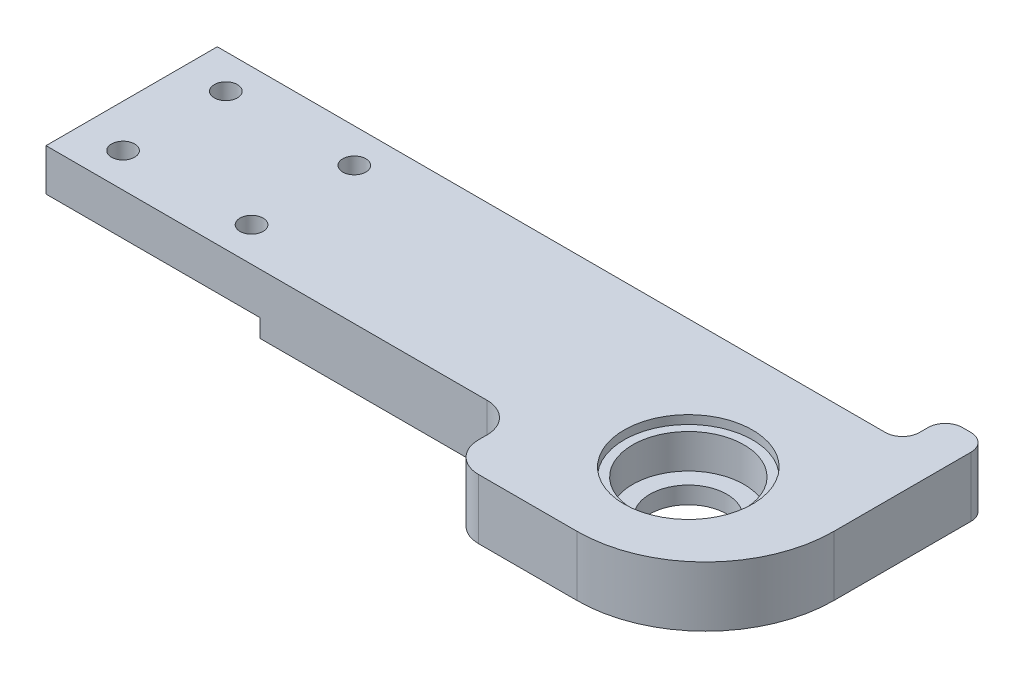
ISO-10303-21;
HEADER;
FILE_DESCRIPTION(('STEP AP214'),'2;1');
FILE_NAME('part.step','',(''),(''),'','','');
FILE_SCHEMA(('AUTOMOTIVE_DESIGN { 1 0 10303 214 1 1 1 1 }'));
ENDSEC;
DATA;
#1=APPLICATION_CONTEXT('core data for automotive mechanical design processes');
#2=APPLICATION_PROTOCOL_DEFINITION('international standard','automotive_design',2000,#1);
#3=PRODUCT_CONTEXT('',#1,'mechanical');
#4=PRODUCT('Part','Part','',(#3));
#5=PRODUCT_RELATED_PRODUCT_CATEGORY('part','',(#4));
#6=PRODUCT_DEFINITION_FORMATION('','',#4);
#7=PRODUCT_DEFINITION_CONTEXT('part definition',#1,'design');
#8=PRODUCT_DEFINITION('design','',#6,#7);
#9=PRODUCT_DEFINITION_SHAPE('','',#8);
#10=(LENGTH_UNIT() NAMED_UNIT(*) SI_UNIT(.MILLI.,.METRE.));
#11=(NAMED_UNIT(*) PLANE_ANGLE_UNIT() SI_UNIT($,.RADIAN.));
#12=(NAMED_UNIT(*) SI_UNIT($,.STERADIAN.) SOLID_ANGLE_UNIT());
#13=UNCERTAINTY_MEASURE_WITH_UNIT(LENGTH_MEASURE(1.E-05),#10,'distance_accuracy_value','');
#14=(GEOMETRIC_REPRESENTATION_CONTEXT(3) GLOBAL_UNCERTAINTY_ASSIGNED_CONTEXT((#13)) GLOBAL_UNIT_ASSIGNED_CONTEXT((#10,
#11,#12)) REPRESENTATION_CONTEXT('',''));
#15=CARTESIAN_POINT('',(0.,0.,0.));
#16=DIRECTION('',(0.,0.,1.));
#17=DIRECTION('',(1.,0.,0.));
#18=AXIS2_PLACEMENT_3D('',#15,#16,#17);
#19=CARTESIAN_POINT('',(0.,7.,-20.));
#20=DIRECTION('',(0.,0.,1.));
#21=DIRECTION('',(1.,0.,0.));
#22=AXIS2_PLACEMENT_3D('',#19,#20,#21);
#23=PLANE('',#22);
#24=DIRECTION('',(-1.,0.,0.));
#25=VECTOR('',#24,1.);
#26=CARTESIAN_POINT('',(0.,7.,-20.));
#27=LINE('',#26,#25);
#28=CARTESIAN_POINT('',(78.,7.,-20.));
#29=VERTEX_POINT('',#28);
#30=CARTESIAN_POINT('',(0.,7.,-20.));
#31=VERTEX_POINT('',#30);
#32=EDGE_CURVE('E211',#29,#31,#27,.T.);
#33=ORIENTED_EDGE('',*,*,#32,.F.);
#34=DIRECTION('',(0.,1.,0.));
#35=VECTOR('',#34,1.);
#36=CARTESIAN_POINT('',(78.,7.,-20.));
#37=LINE('',#36,#35);
#38=CARTESIAN_POINT('',(78.,0.,-20.));
#39=VERTEX_POINT('',#38);
#40=EDGE_CURVE('E312',#29,#39,#37,.F.);
#41=ORIENTED_EDGE('',*,*,#40,.T.);
#42=DIRECTION('',(-1.,0.,0.));
#43=VECTOR('',#42,1.);
#44=CARTESIAN_POINT('',(0.,0.,-20.));
#45=LINE('',#44,#43);
#46=CARTESIAN_POINT('',(25.,0.,-20.));
#47=VERTEX_POINT('',#46);
#48=EDGE_CURVE('E177',#39,#47,#45,.T.);
#49=ORIENTED_EDGE('',*,*,#48,.T.);
#50=DIRECTION('',(0.,-1.,0.));
#51=VECTOR('',#50,1.);
#52=CARTESIAN_POINT('',(25.,2.1,-20.));
#53=LINE('',#52,#51);
#54=CARTESIAN_POINT('',(25.,2.1,-20.));
#55=VERTEX_POINT('',#54);
#56=EDGE_CURVE('E157',#55,#47,#53,.T.);
#57=ORIENTED_EDGE('',*,*,#56,.F.);
#58=DIRECTION('',(1.,0.,0.));
#59=VECTOR('',#58,1.);
#60=CARTESIAN_POINT('',(0.,2.1,-20.));
#61=LINE('',#60,#59);
#62=CARTESIAN_POINT('',(0.,2.1,-20.));
#63=VERTEX_POINT('',#62);
#64=EDGE_CURVE('E165',#63,#55,#61,.T.);
#65=ORIENTED_EDGE('',*,*,#64,.F.);
#66=DIRECTION('',(0.,-1.,0.));
#67=VECTOR('',#66,1.);
#68=CARTESIAN_POINT('',(0.,7.,-20.));
#69=LINE('',#68,#67);
#70=EDGE_CURVE('E214',#31,#63,#69,.T.);
#71=ORIENTED_EDGE('',*,*,#70,.F.);
#72=EDGE_LOOP('',(#33,#41,#49,#57,#65,#71));
#73=FACE_BOUND('',#72,.T.);
#74=ADVANCED_FACE('F39',(#73),#23,.F.);
#75=CARTESIAN_POINT('',(70.,7.,-5.));
#76=DIRECTION('',(0.,-1.,0.));
#77=DIRECTION('',(0.,0.,-1.));
#78=AXIS2_PLACEMENT_3D('',#75,#76,#77);
#79=CYLINDRICAL_SURFACE('',#78,4.5);
#80=CARTESIAN_POINT('',(70.,0.,-5.));
#81=DIRECTION('',(0.,1.,0.));
#82=DIRECTION('',(0.,0.,1.));
#83=AXIS2_PLACEMENT_3D('',#80,#81,#82);
#84=CIRCLE('',#83,4.5);
#85=CARTESIAN_POINT('',(70.,0.,-0.499999999999995));
#86=VERTEX_POINT('',#85);
#87=EDGE_CURVE('E182',#86,#86,#84,.T.);
#88=ORIENTED_EDGE('',*,*,#87,.F.);
#89=EDGE_LOOP('',(#88));
#90=FACE_BOUND('',#89,.T.);
#91=CARTESIAN_POINT('',(70.,2.,-5.));
#92=DIRECTION('',(0.,1.,0.));
#93=DIRECTION('',(0.,0.,1.));
#94=AXIS2_PLACEMENT_3D('',#91,#92,#93);
#95=CIRCLE('',#94,4.5);
#96=CARTESIAN_POINT('',(70.,2.,-0.499999999999995));
#97=VERTEX_POINT('',#96);
#98=EDGE_CURVE('E265',#97,#97,#95,.T.);
#99=ORIENTED_EDGE('',*,*,#98,.T.);
#100=EDGE_LOOP('',(#99));
#101=FACE_BOUND('',#100,.T.);
#102=ADVANCED_FACE('F437',(#90,#101),#79,.F.);
#103=CARTESIAN_POINT('',(0.,7.,0.));
#104=DIRECTION('',(1.,0.,0.));
#105=DIRECTION('',(0.,0.,-1.));
#106=AXIS2_PLACEMENT_3D('',#103,#104,#105);
#107=PLANE('',#106);
#108=DIRECTION('',(0.,0.,-1.));
#109=VECTOR('',#108,1.);
#110=CARTESIAN_POINT('',(0.,2.1,0.));
#111=LINE('',#110,#109);
#112=CARTESIAN_POINT('',(0.,2.1,0.));
#113=VERTEX_POINT('',#112);
#114=EDGE_CURVE('E170',#113,#63,#111,.T.);
#115=ORIENTED_EDGE('',*,*,#114,.F.);
#116=DIRECTION('',(0.,-1.,0.));
#117=VECTOR('',#116,1.);
#118=CARTESIAN_POINT('',(0.,7.,0.));
#119=LINE('',#118,#117);
#120=CARTESIAN_POINT('',(0.,7.,0.));
#121=VERTEX_POINT('',#120);
#122=EDGE_CURVE('E234',#121,#113,#119,.T.);
#123=ORIENTED_EDGE('',*,*,#122,.F.);
#124=DIRECTION('',(0.,0.,1.));
#125=VECTOR('',#124,1.);
#126=CARTESIAN_POINT('',(0.,7.,0.));
#127=LINE('',#126,#125);
#128=EDGE_CURVE('E191',#31,#121,#127,.T.);
#129=ORIENTED_EDGE('',*,*,#128,.F.);
#130=ORIENTED_EDGE('',*,*,#70,.T.);
#131=EDGE_LOOP('',(#115,#123,#129,#130));
#132=FACE_BOUND('',#131,.T.);
#133=ADVANCED_FACE('F442',(#132),#107,.F.);
#134=CARTESIAN_POINT('',(0.,7.,0.));
#135=DIRECTION('',(0.,-1.,0.));
#136=DIRECTION('',(0.,0.,-1.));
#137=AXIS2_PLACEMENT_3D('',#134,#135,#136);
#138=PLANE('',#137);
#139=CARTESIAN_POINT('',(70.,7.,-5.));
#140=DIRECTION('',(0.,1.,0.));
#141=DIRECTION('',(0.,0.,1.));
#142=AXIS2_PLACEMENT_3D('',#139,#140,#141);
#143=CIRCLE('',#142,7.5);
#144=CARTESIAN_POINT('',(70.,7.,2.5));
#145=VERTEX_POINT('',#144);
#146=EDGE_CURVE('E269',#145,#145,#143,.T.);
#147=ORIENTED_EDGE('',*,*,#146,.F.);
#148=EDGE_LOOP('',(#147));
#149=FACE_BOUND('',#148,.T.);
#150=CARTESIAN_POINT('',(5.,7.,-16.));
#151=DIRECTION('',(0.,-1.,0.));
#152=DIRECTION('',(0.,0.,-1.));
#153=AXIS2_PLACEMENT_3D('',#150,#151,#152);
#154=CIRCLE('',#153,1.35);
#155=CARTESIAN_POINT('',(5.,7.,-17.35));
#156=VERTEX_POINT('',#155);
#157=EDGE_CURVE('E376',#156,#156,#154,.T.);
#158=ORIENTED_EDGE('',*,*,#157,.T.);
#159=EDGE_LOOP('',(#158));
#160=FACE_BOUND('',#159,.T.);
#161=CARTESIAN_POINT('',(20.,7.,-16.));
#162=DIRECTION('',(0.,-1.,0.));
#163=DIRECTION('',(0.,0.,-1.));
#164=AXIS2_PLACEMENT_3D('',#161,#162,#163);
#165=CIRCLE('',#164,1.35);
#166=CARTESIAN_POINT('',(20.,7.,-17.35));
#167=VERTEX_POINT('',#166);
#168=EDGE_CURVE('E372',#167,#167,#165,.T.);
#169=ORIENTED_EDGE('',*,*,#168,.T.);
#170=EDGE_LOOP('',(#169));
#171=FACE_BOUND('',#170,.T.);
#172=CARTESIAN_POINT('',(20.,7.,-4.));
#173=DIRECTION('',(0.,-1.,0.));
#174=DIRECTION('',(0.,0.,-1.));
#175=AXIS2_PLACEMENT_3D('',#172,#173,#174);
#176=CIRCLE('',#175,1.35);
#177=CARTESIAN_POINT('',(20.,7.,-5.35));
#178=VERTEX_POINT('',#177);
#179=EDGE_CURVE('E368',#178,#178,#176,.T.);
#180=ORIENTED_EDGE('',*,*,#179,.T.);
#181=EDGE_LOOP('',(#180));
#182=FACE_BOUND('',#181,.T.);
#183=CARTESIAN_POINT('',(5.,7.,-4.));
#184=DIRECTION('',(0.,-1.,0.));
#185=DIRECTION('',(0.,0.,-1.));
#186=AXIS2_PLACEMENT_3D('',#183,#184,#185);
#187=CIRCLE('',#186,1.35);
#188=CARTESIAN_POINT('',(5.,7.,-5.35));
#189=VERTEX_POINT('',#188);
#190=EDGE_CURVE('E364',#189,#189,#187,.T.);
#191=ORIENTED_EDGE('',*,*,#190,.T.);
#192=EDGE_LOOP('',(#191));
#193=FACE_BOUND('',#192,.T.);
#194=DIRECTION('',(0.,0.,-1.));
#195=VECTOR('',#194,1.);
#196=CARTESIAN_POINT('',(85.,7.,0.));
#197=LINE('',#196,#195);
#198=CARTESIAN_POINT('',(85.,7.,-7.));
#199=VERTEX_POINT('',#198);
#200=CARTESIAN_POINT('',(85.,7.,-23.));
#201=VERTEX_POINT('',#200);
#202=EDGE_CURVE('E207',#199,#201,#197,.T.);
#203=ORIENTED_EDGE('',*,*,#202,.T.);
#204=CARTESIAN_POINT('',(83.,7.,-23.));
#205=DIRECTION('',(0.,-1.,0.));
#206=DIRECTION('',(0.,0.,-1.));
#207=AXIS2_PLACEMENT_3D('',#204,#205,#206);
#208=CIRCLE('',#207,2.);
#209=CARTESIAN_POINT('',(83.,7.,-25.));
#210=VERTEX_POINT('',#209);
#211=EDGE_CURVE('E290',#201,#210,#208,.F.);
#212=ORIENTED_EDGE('',*,*,#211,.T.);
#213=DIRECTION('',(-1.,0.,0.));
#214=VECTOR('',#213,1.);
#215=CARTESIAN_POINT('',(85.,7.,-25.));
#216=LINE('',#215,#214);
#217=CARTESIAN_POINT('',(82.,7.,-25.));
#218=VERTEX_POINT('',#217);
#219=EDGE_CURVE('E419',#210,#218,#216,.T.);
#220=ORIENTED_EDGE('',*,*,#219,.T.);
#221=CARTESIAN_POINT('',(82.,7.,-23.));
#222=DIRECTION('',(0.,-1.,0.));
#223=DIRECTION('',(0.,0.,-1.));
#224=AXIS2_PLACEMENT_3D('',#221,#222,#223);
#225=CIRCLE('',#224,2.);
#226=CARTESIAN_POINT('',(80.,7.,-23.));
#227=VERTEX_POINT('',#226);
#228=EDGE_CURVE('E287',#218,#227,#225,.F.);
#229=ORIENTED_EDGE('',*,*,#228,.T.);
#230=DIRECTION('',(0.,0.,1.));
#231=VECTOR('',#230,1.);
#232=CARTESIAN_POINT('',(80.,7.,-20.));
#233=LINE('',#232,#231);
#234=CARTESIAN_POINT('',(80.,7.,-22.));
#235=VERTEX_POINT('',#234);
#236=EDGE_CURVE('E318',#227,#235,#233,.T.);
#237=ORIENTED_EDGE('',*,*,#236,.T.);
#238=CARTESIAN_POINT('',(78.,7.,-22.));
#239=DIRECTION('',(0.,-1.,0.));
#240=DIRECTION('',(0.,0.,-1.));
#241=AXIS2_PLACEMENT_3D('',#238,#239,#240);
#242=CIRCLE('',#241,2.);
#243=EDGE_CURVE('E48',#235,#29,#242,.T.);
#244=ORIENTED_EDGE('',*,*,#243,.T.);
#245=ORIENTED_EDGE('',*,*,#32,.T.);
#246=ORIENTED_EDGE('',*,*,#128,.T.);
#247=DIRECTION('',(1.,0.,0.));
#248=VECTOR('',#247,1.);
#249=CARTESIAN_POINT('',(0.,7.,0.));
#250=LINE('',#249,#248);
#251=CARTESIAN_POINT('',(51.5,7.,0.));
#252=VERTEX_POINT('',#251);
#253=EDGE_CURVE('E195',#121,#252,#250,.T.);
#254=ORIENTED_EDGE('',*,*,#253,.T.);
#255=CARTESIAN_POINT('',(51.5,7.,3.5));
#256=DIRECTION('',(0.,-1.,0.));
#257=DIRECTION('',(0.,0.,-1.));
#258=AXIS2_PLACEMENT_3D('',#255,#256,#257);
#259=CIRCLE('',#258,3.5);
#260=CARTESIAN_POINT('',(55.,7.,3.5));
#261=VERTEX_POINT('',#260);
#262=EDGE_CURVE('E261',#252,#261,#259,.T.);
#263=ORIENTED_EDGE('',*,*,#262,.T.);
#264=DIRECTION('',(0.,0.,1.));
#265=VECTOR('',#264,1.);
#266=CARTESIAN_POINT('',(55.,7.,0.));
#267=LINE('',#266,#265);
#268=CARTESIAN_POINT('',(55.,7.,4.5));
#269=VERTEX_POINT('',#268);
#270=EDGE_CURVE('E199',#261,#269,#267,.T.);
#271=ORIENTED_EDGE('',*,*,#270,.T.);
#272=CARTESIAN_POINT('',(58.5,7.,4.5));
#273=DIRECTION('',(0.,-1.,0.));
#274=DIRECTION('',(0.,0.,-1.));
#275=AXIS2_PLACEMENT_3D('',#272,#273,#274);
#276=CIRCLE('',#275,3.5);
#277=CARTESIAN_POINT('',(58.5,7.,8.));
#278=VERTEX_POINT('',#277);
#279=EDGE_CURVE('E252',#269,#278,#276,.F.);
#280=ORIENTED_EDGE('',*,*,#279,.T.);
#281=DIRECTION('',(1.,0.,0.));
#282=VECTOR('',#281,1.);
#283=CARTESIAN_POINT('',(85.,7.,8.));
#284=LINE('',#283,#282);
#285=CARTESIAN_POINT('',(70.,7.,8.));
#286=VERTEX_POINT('',#285);
#287=EDGE_CURVE('E203',#278,#286,#284,.T.);
#288=ORIENTED_EDGE('',*,*,#287,.T.);
#289=CARTESIAN_POINT('',(70.,7.,-7.));
#290=DIRECTION('',(0.,-1.,0.));
#291=DIRECTION('',(0.,0.,-1.));
#292=AXIS2_PLACEMENT_3D('',#289,#290,#291);
#293=CIRCLE('',#292,15.);
#294=EDGE_CURVE('E280',#286,#199,#293,.F.);
#295=ORIENTED_EDGE('',*,*,#294,.T.);
#296=EDGE_LOOP('',(#203,#212,#220,#229,#237,#244,#245,#246,#254,#263,#271,#280,#288,#295));
#297=FACE_BOUND('',#296,.T.);
#298=ADVANCED_FACE('F317',(#149,#160,#171,#182,#193,#297),#138,.F.);
#299=CARTESIAN_POINT('',(0.,0.,0.));
#300=DIRECTION('',(0.,-1.,0.));
#301=DIRECTION('',(0.,0.,-1.));
#302=AXIS2_PLACEMENT_3D('',#299,#300,#301);
#303=PLANE('',#302);
#304=DIRECTION('',(-1.,0.,0.));
#305=VECTOR('',#304,1.);
#306=CARTESIAN_POINT('',(85.,0.,-25.));
#307=LINE('',#306,#305);
#308=CARTESIAN_POINT('',(83.,0.,-25.));
#309=VERTEX_POINT('',#308);
#310=CARTESIAN_POINT('',(82.,0.,-25.));
#311=VERTEX_POINT('',#310);
#312=EDGE_CURVE('E328',#309,#311,#307,.T.);
#313=ORIENTED_EDGE('',*,*,#312,.F.);
#314=CARTESIAN_POINT('',(83.,0.,-23.));
#315=DIRECTION('',(0.,-1.,0.));
#316=DIRECTION('',(0.,0.,-1.));
#317=AXIS2_PLACEMENT_3D('',#314,#315,#316);
#318=CIRCLE('',#317,2.);
#319=CARTESIAN_POINT('',(85.,0.,-23.));
#320=VERTEX_POINT('',#319);
#321=EDGE_CURVE('E303',#309,#320,#318,.T.);
#322=ORIENTED_EDGE('',*,*,#321,.T.);
#323=DIRECTION('',(0.,0.,-1.));
#324=VECTOR('',#323,1.);
#325=CARTESIAN_POINT('',(85.,0.,0.));
#326=LINE('',#325,#324);
#327=CARTESIAN_POINT('',(85.,0.,-7.));
#328=VERTEX_POINT('',#327);
#329=EDGE_CURVE('E226',#328,#320,#326,.T.);
#330=ORIENTED_EDGE('',*,*,#329,.F.);
#331=CARTESIAN_POINT('',(70.,0.,-7.));
#332=DIRECTION('',(0.,-1.,0.));
#333=DIRECTION('',(0.,0.,-1.));
#334=AXIS2_PLACEMENT_3D('',#331,#332,#333);
#335=CIRCLE('',#334,15.);
#336=CARTESIAN_POINT('',(70.,0.,8.));
#337=VERTEX_POINT('',#336);
#338=EDGE_CURVE('E274',#328,#337,#335,.T.);
#339=ORIENTED_EDGE('',*,*,#338,.T.);
#340=DIRECTION('',(1.,0.,0.));
#341=VECTOR('',#340,1.);
#342=CARTESIAN_POINT('',(85.,0.,8.));
#343=LINE('',#342,#341);
#344=CARTESIAN_POINT('',(58.5,0.,8.));
#345=VERTEX_POINT('',#344);
#346=EDGE_CURVE('E222',#345,#337,#343,.T.);
#347=ORIENTED_EDGE('',*,*,#346,.F.);
#348=CARTESIAN_POINT('',(58.5,0.,4.5));
#349=DIRECTION('',(0.,-1.,0.));
#350=DIRECTION('',(0.,0.,-1.));
#351=AXIS2_PLACEMENT_3D('',#348,#349,#350);
#352=CIRCLE('',#351,3.5);
#353=CARTESIAN_POINT('',(55.,0.,4.5));
#354=VERTEX_POINT('',#353);
#355=EDGE_CURVE('E242',#345,#354,#352,.T.);
#356=ORIENTED_EDGE('',*,*,#355,.T.);
#357=DIRECTION('',(0.,0.,1.));
#358=VECTOR('',#357,1.);
#359=CARTESIAN_POINT('',(55.,0.,0.));
#360=LINE('',#359,#358);
#361=CARTESIAN_POINT('',(55.,0.,3.5));
#362=VERTEX_POINT('',#361);
#363=EDGE_CURVE('E218',#362,#354,#360,.T.);
#364=ORIENTED_EDGE('',*,*,#363,.F.);
#365=CARTESIAN_POINT('',(51.5,0.,3.5));
#366=DIRECTION('',(0.,-1.,0.));
#367=DIRECTION('',(0.,0.,-1.));
#368=AXIS2_PLACEMENT_3D('',#365,#366,#367);
#369=CIRCLE('',#368,3.5);
#370=CARTESIAN_POINT('',(51.5,0.,0.));
#371=VERTEX_POINT('',#370);
#372=EDGE_CURVE('E258',#362,#371,#369,.F.);
#373=ORIENTED_EDGE('',*,*,#372,.T.);
#374=DIRECTION('',(1.,0.,0.));
#375=VECTOR('',#374,1.);
#376=CARTESIAN_POINT('',(0.,0.,0.));
#377=LINE('',#376,#375);
#378=CARTESIAN_POINT('',(25.,0.,0.));
#379=VERTEX_POINT('',#378);
#380=EDGE_CURVE('E190',#379,#371,#377,.T.);
#381=ORIENTED_EDGE('',*,*,#380,.F.);
#382=DIRECTION('',(0.,0.,1.));
#383=VECTOR('',#382,1.);
#384=CARTESIAN_POINT('',(25.,0.,0.));
#385=LINE('',#384,#383);
#386=EDGE_CURVE('E380',#47,#379,#385,.T.);
#387=ORIENTED_EDGE('',*,*,#386,.F.);
#388=ORIENTED_EDGE('',*,*,#48,.F.);
#389=CARTESIAN_POINT('',(78.,0.,-22.));
#390=DIRECTION('',(0.,-1.,0.));
#391=DIRECTION('',(0.,0.,-1.));
#392=AXIS2_PLACEMENT_3D('',#389,#390,#391);
#393=CIRCLE('',#392,2.);
#394=CARTESIAN_POINT('',(80.,0.,-22.));
#395=VERTEX_POINT('',#394);
#396=EDGE_CURVE('E11',#39,#395,#393,.F.);
#397=ORIENTED_EDGE('',*,*,#396,.T.);
#398=DIRECTION('',(0.,0.,1.));
#399=VECTOR('',#398,1.);
#400=CARTESIAN_POINT('',(80.,0.,-20.));
#401=LINE('',#400,#399);
#402=CARTESIAN_POINT('',(80.,0.,-23.));
#403=VERTEX_POINT('',#402);
#404=EDGE_CURVE('E324',#403,#395,#401,.T.);
#405=ORIENTED_EDGE('',*,*,#404,.F.);
#406=CARTESIAN_POINT('',(82.,0.,-23.));
#407=DIRECTION('',(0.,-1.,0.));
#408=DIRECTION('',(0.,0.,-1.));
#409=AXIS2_PLACEMENT_3D('',#406,#407,#408);
#410=CIRCLE('',#409,2.);
#411=EDGE_CURVE('E300',#403,#311,#410,.T.);
#412=ORIENTED_EDGE('',*,*,#411,.T.);
#413=EDGE_LOOP('',(#313,#322,#330,#339,#347,#356,#364,#373,#381,#387,#388,#397,#405,#412));
#414=FACE_BOUND('',#413,.T.);
#415=ORIENTED_EDGE('',*,*,#87,.T.);
#416=EDGE_LOOP('',(#415));
#417=FACE_BOUND('',#416,.T.);
#418=ADVANCED_FACE('F388',(#414,#417),#303,.T.);
#419=CARTESIAN_POINT('',(0.,7.,0.));
#420=DIRECTION('',(0.,0.,-1.));
#421=DIRECTION('',(-1.,0.,0.));
#422=AXIS2_PLACEMENT_3D('',#419,#420,#421);
#423=PLANE('',#422);
#424=ORIENTED_EDGE('',*,*,#380,.T.);
#425=DIRECTION('',(0.,-1.,0.));
#426=VECTOR('',#425,1.);
#427=CARTESIAN_POINT('',(51.5,7.,0.));
#428=LINE('',#427,#426);
#429=EDGE_CURVE('E255',#371,#252,#428,.F.);
#430=ORIENTED_EDGE('',*,*,#429,.T.);
#431=ORIENTED_EDGE('',*,*,#253,.F.);
#432=ORIENTED_EDGE('',*,*,#122,.T.);
#433=DIRECTION('',(-1.,0.,0.));
#434=VECTOR('',#433,1.);
#435=CARTESIAN_POINT('',(0.,2.1,0.));
#436=LINE('',#435,#434);
#437=CARTESIAN_POINT('',(25.,2.1,0.));
#438=VERTEX_POINT('',#437);
#439=EDGE_CURVE('E164',#438,#113,#436,.T.);
#440=ORIENTED_EDGE('',*,*,#439,.F.);
#441=DIRECTION('',(0.,-1.,0.));
#442=VECTOR('',#441,1.);
#443=CARTESIAN_POINT('',(25.,2.1,0.));
#444=LINE('',#443,#442);
#445=EDGE_CURVE('E160',#438,#379,#444,.T.);
#446=ORIENTED_EDGE('',*,*,#445,.T.);
#447=EDGE_LOOP('',(#424,#430,#431,#432,#440,#446));
#448=FACE_BOUND('',#447,.T.);
#449=ADVANCED_FACE('F385',(#448),#423,.F.);
#450=CARTESIAN_POINT('',(55.,7.,0.));
#451=DIRECTION('',(1.,0.,0.));
#452=DIRECTION('',(0.,0.,-1.));
#453=AXIS2_PLACEMENT_3D('',#450,#451,#452);
#454=PLANE('',#453);
#455=ORIENTED_EDGE('',*,*,#363,.T.);
#456=DIRECTION('',(0.,-1.,0.));
#457=VECTOR('',#456,1.);
#458=CARTESIAN_POINT('',(55.,7.,4.5));
#459=LINE('',#458,#457);
#460=EDGE_CURVE('E249',#354,#269,#459,.F.);
#461=ORIENTED_EDGE('',*,*,#460,.T.);
#462=ORIENTED_EDGE('',*,*,#270,.F.);
#463=DIRECTION('',(0.,-1.,0.));
#464=VECTOR('',#463,1.);
#465=CARTESIAN_POINT('',(55.,0.,3.5));
#466=LINE('',#465,#464);
#467=EDGE_CURVE('E245',#261,#362,#466,.T.);
#468=ORIENTED_EDGE('',*,*,#467,.T.);
#469=EDGE_LOOP('',(#455,#461,#462,#468));
#470=FACE_BOUND('',#469,.T.);
#471=ADVANCED_FACE('F397',(#470),#454,.F.);
#472=CARTESIAN_POINT('',(85.,7.,8.));
#473=DIRECTION('',(0.,0.,-1.));
#474=DIRECTION('',(-1.,0.,0.));
#475=AXIS2_PLACEMENT_3D('',#472,#473,#474);
#476=PLANE('',#475);
#477=ORIENTED_EDGE('',*,*,#346,.T.);
#478=DIRECTION('',(0.,-1.,0.));
#479=VECTOR('',#478,1.);
#480=CARTESIAN_POINT('',(70.,7.,8.));
#481=LINE('',#480,#479);
#482=EDGE_CURVE('E277',#337,#286,#481,.F.);
#483=ORIENTED_EDGE('',*,*,#482,.T.);
#484=ORIENTED_EDGE('',*,*,#287,.F.);
#485=DIRECTION('',(0.,-1.,0.));
#486=VECTOR('',#485,1.);
#487=CARTESIAN_POINT('',(58.5,7.,8.));
#488=LINE('',#487,#486);
#489=EDGE_CURVE('E238',#278,#345,#488,.T.);
#490=ORIENTED_EDGE('',*,*,#489,.T.);
#491=EDGE_LOOP('',(#477,#483,#484,#490));
#492=FACE_BOUND('',#491,.T.);
#493=ADVANCED_FACE('F406',(#492),#476,.F.);
#494=CARTESIAN_POINT('',(85.,7.,0.));
#495=DIRECTION('',(-1.,0.,0.));
#496=DIRECTION('',(0.,0.,1.));
#497=AXIS2_PLACEMENT_3D('',#494,#495,#496);
#498=PLANE('',#497);
#499=ORIENTED_EDGE('',*,*,#329,.T.);
#500=DIRECTION('',(0.,1.,0.));
#501=VECTOR('',#500,1.);
#502=CARTESIAN_POINT('',(85.,7.,-23.));
#503=LINE('',#502,#501);
#504=EDGE_CURVE('E283',#320,#201,#503,.T.);
#505=ORIENTED_EDGE('',*,*,#504,.T.);
#506=ORIENTED_EDGE('',*,*,#202,.F.);
#507=DIRECTION('',(0.,-1.,0.));
#508=VECTOR('',#507,1.);
#509=CARTESIAN_POINT('',(85.,7.,-7.));
#510=LINE('',#509,#508);
#511=EDGE_CURVE('E264',#199,#328,#510,.T.);
#512=ORIENTED_EDGE('',*,*,#511,.T.);
#513=EDGE_LOOP('',(#499,#505,#506,#512));
#514=FACE_BOUND('',#513,.T.);
#515=ADVANCED_FACE('F415',(#514),#498,.F.);
#516=CARTESIAN_POINT('',(25.,2.1,0.));
#517=DIRECTION('',(1.,0.,0.));
#518=DIRECTION('',(0.,0.,-1.));
#519=AXIS2_PLACEMENT_3D('',#516,#517,#518);
#520=PLANE('',#519);
#521=ORIENTED_EDGE('',*,*,#386,.T.);
#522=ORIENTED_EDGE('',*,*,#445,.F.);
#523=DIRECTION('',(0.,0.,1.));
#524=VECTOR('',#523,1.);
#525=CARTESIAN_POINT('',(25.,2.1,0.));
#526=LINE('',#525,#524);
#527=EDGE_CURVE('E153',#55,#438,#526,.T.);
#528=ORIENTED_EDGE('',*,*,#527,.F.);
#529=ORIENTED_EDGE('',*,*,#56,.T.);
#530=EDGE_LOOP('',(#521,#522,#528,#529));
#531=FACE_BOUND('',#530,.T.);
#532=ADVANCED_FACE('F155',(#531),#520,.F.);
#533=CARTESIAN_POINT('',(0.,2.1,0.));
#534=DIRECTION('',(0.,-1.,0.));
#535=DIRECTION('',(0.,0.,-1.));
#536=AXIS2_PLACEMENT_3D('',#533,#534,#535);
#537=PLANE('',#536);
#538=CARTESIAN_POINT('',(5.,2.1,-16.));
#539=DIRECTION('',(0.,-1.,0.));
#540=DIRECTION('',(0.,0.,-1.));
#541=AXIS2_PLACEMENT_3D('',#538,#539,#540);
#542=CIRCLE('',#541,1.35);
#543=CARTESIAN_POINT('',(5.,2.1,-17.35));
#544=VERTEX_POINT('',#543);
#545=EDGE_CURVE('E345',#544,#544,#542,.T.);
#546=ORIENTED_EDGE('',*,*,#545,.F.);
#547=EDGE_LOOP('',(#546));
#548=FACE_BOUND('',#547,.T.);
#549=CARTESIAN_POINT('',(20.,2.1,-16.));
#550=DIRECTION('',(0.,-1.,0.));
#551=DIRECTION('',(0.,0.,-1.));
#552=AXIS2_PLACEMENT_3D('',#549,#550,#551);
#553=CIRCLE('',#552,1.35);
#554=CARTESIAN_POINT('',(20.,2.1,-17.35));
#555=VERTEX_POINT('',#554);
#556=EDGE_CURVE('E354',#555,#555,#553,.T.);
#557=ORIENTED_EDGE('',*,*,#556,.F.);
#558=EDGE_LOOP('',(#557));
#559=FACE_BOUND('',#558,.T.);
#560=CARTESIAN_POINT('',(20.,2.1,-4.));
#561=DIRECTION('',(0.,-1.,0.));
#562=DIRECTION('',(0.,0.,-1.));
#563=AXIS2_PLACEMENT_3D('',#560,#561,#562);
#564=CIRCLE('',#563,1.35);
#565=CARTESIAN_POINT('',(20.,2.1,-5.35));
#566=VERTEX_POINT('',#565);
#567=EDGE_CURVE('E349',#566,#566,#564,.T.);
#568=ORIENTED_EDGE('',*,*,#567,.F.);
#569=EDGE_LOOP('',(#568));
#570=FACE_BOUND('',#569,.T.);
#571=CARTESIAN_POINT('',(5.,2.1,-4.));
#572=DIRECTION('',(0.,-1.,0.));
#573=DIRECTION('',(0.,0.,-1.));
#574=AXIS2_PLACEMENT_3D('',#571,#572,#573);
#575=CIRCLE('',#574,1.35);
#576=CARTESIAN_POINT('',(5.,2.1,-5.35));
#577=VERTEX_POINT('',#576);
#578=EDGE_CURVE('E353',#577,#577,#575,.T.);
#579=ORIENTED_EDGE('',*,*,#578,.F.);
#580=EDGE_LOOP('',(#579));
#581=FACE_BOUND('',#580,.T.);
#582=ORIENTED_EDGE('',*,*,#114,.T.);
#583=ORIENTED_EDGE('',*,*,#64,.T.);
#584=ORIENTED_EDGE('',*,*,#527,.T.);
#585=ORIENTED_EDGE('',*,*,#439,.T.);
#586=EDGE_LOOP('',(#582,#583,#584,#585));
#587=FACE_BOUND('',#586,.T.);
#588=ADVANCED_FACE('F168',(#548,#559,#570,#581,#587),#537,.T.);
#589=CARTESIAN_POINT('',(5.,16.1,-4.));
#590=DIRECTION('',(0.,-1.,0.));
#591=DIRECTION('',(0.,0.,-1.));
#592=AXIS2_PLACEMENT_3D('',#589,#590,#591);
#593=CYLINDRICAL_SURFACE('',#592,1.35);
#594=ORIENTED_EDGE('',*,*,#578,.T.);
#595=EDGE_LOOP('',(#594));
#596=FACE_BOUND('',#595,.T.);
#597=ORIENTED_EDGE('',*,*,#190,.F.);
#598=EDGE_LOOP('',(#597));
#599=FACE_BOUND('',#598,.T.);
#600=ADVANCED_FACE('F495',(#596,#599),#593,.F.);
#601=CARTESIAN_POINT('',(20.,16.1,-4.));
#602=DIRECTION('',(0.,-1.,0.));
#603=DIRECTION('',(0.,0.,-1.));
#604=AXIS2_PLACEMENT_3D('',#601,#602,#603);
#605=CYLINDRICAL_SURFACE('',#604,1.35);
#606=ORIENTED_EDGE('',*,*,#567,.T.);
#607=EDGE_LOOP('',(#606));
#608=FACE_BOUND('',#607,.T.);
#609=ORIENTED_EDGE('',*,*,#179,.F.);
#610=EDGE_LOOP('',(#609));
#611=FACE_BOUND('',#610,.T.);
#612=ADVANCED_FACE('F491',(#608,#611),#605,.F.);
#613=CARTESIAN_POINT('',(20.,16.1,-16.));
#614=DIRECTION('',(0.,-1.,0.));
#615=DIRECTION('',(0.,0.,-1.));
#616=AXIS2_PLACEMENT_3D('',#613,#614,#615);
#617=CYLINDRICAL_SURFACE('',#616,1.35);
#618=ORIENTED_EDGE('',*,*,#556,.T.);
#619=EDGE_LOOP('',(#618));
#620=FACE_BOUND('',#619,.T.);
#621=ORIENTED_EDGE('',*,*,#168,.F.);
#622=EDGE_LOOP('',(#621));
#623=FACE_BOUND('',#622,.T.);
#624=ADVANCED_FACE('F494',(#620,#623),#617,.F.);
#625=CARTESIAN_POINT('',(5.,16.1,-16.));
#626=DIRECTION('',(0.,-1.,0.));
#627=DIRECTION('',(0.,0.,-1.));
#628=AXIS2_PLACEMENT_3D('',#625,#626,#627);
#629=CYLINDRICAL_SURFACE('',#628,1.35);
#630=ORIENTED_EDGE('',*,*,#545,.T.);
#631=EDGE_LOOP('',(#630));
#632=FACE_BOUND('',#631,.T.);
#633=ORIENTED_EDGE('',*,*,#157,.F.);
#634=EDGE_LOOP('',(#633));
#635=FACE_BOUND('',#634,.T.);
#636=ADVANCED_FACE('F461',(#632,#635),#629,.F.);
#637=CARTESIAN_POINT('',(58.5,7.,4.5));
#638=DIRECTION('',(0.,-1.,0.));
#639=DIRECTION('',(0.,0.,-1.));
#640=AXIS2_PLACEMENT_3D('',#637,#638,#639);
#641=CYLINDRICAL_SURFACE('',#640,3.5);
#642=ORIENTED_EDGE('',*,*,#279,.F.);
#643=ORIENTED_EDGE('',*,*,#460,.F.);
#644=ORIENTED_EDGE('',*,*,#355,.F.);
#645=ORIENTED_EDGE('',*,*,#489,.F.);
#646=EDGE_LOOP('',(#642,#643,#644,#645));
#647=FACE_BOUND('',#646,.T.);
#648=ADVANCED_FACE('F403',(#647),#641,.T.);
#649=CARTESIAN_POINT('',(51.5,7.,3.5));
#650=DIRECTION('',(0.,1.,0.));
#651=DIRECTION('',(0.,0.,1.));
#652=AXIS2_PLACEMENT_3D('',#649,#650,#651);
#653=CYLINDRICAL_SURFACE('',#652,3.5);
#654=ORIENTED_EDGE('',*,*,#262,.F.);
#655=ORIENTED_EDGE('',*,*,#429,.F.);
#656=ORIENTED_EDGE('',*,*,#372,.F.);
#657=ORIENTED_EDGE('',*,*,#467,.F.);
#658=EDGE_LOOP('',(#654,#655,#656,#657));
#659=FACE_BOUND('',#658,.T.);
#660=ADVANCED_FACE('F394',(#659),#653,.F.);
#661=CARTESIAN_POINT('',(70.,6.,-5.));
#662=DIRECTION('',(0.,1.,0.));
#663=DIRECTION('',(0.,0.,1.));
#664=AXIS2_PLACEMENT_3D('',#661,#662,#663);
#665=CYLINDRICAL_SURFACE('',#664,7.5);
#666=CARTESIAN_POINT('',(70.,6.,-5.));
#667=DIRECTION('',(0.,1.,0.));
#668=DIRECTION('',(0.,0.,1.));
#669=AXIS2_PLACEMENT_3D('',#666,#667,#668);
#670=CIRCLE('',#669,7.5);
#671=CARTESIAN_POINT('',(70.,6.,2.5));
#672=VERTEX_POINT('',#671);
#673=EDGE_CURVE('E341',#672,#672,#670,.T.);
#674=ORIENTED_EDGE('',*,*,#673,.F.);
#675=EDGE_LOOP('',(#674));
#676=FACE_BOUND('',#675,.T.);
#677=ORIENTED_EDGE('',*,*,#146,.T.);
#678=EDGE_LOOP('',(#677));
#679=FACE_BOUND('',#678,.T.);
#680=ADVANCED_FACE('F464',(#676,#679),#665,.F.);
#681=CARTESIAN_POINT('',(70.,6.,-5.));
#682=DIRECTION('',(0.,1.,0.));
#683=DIRECTION('',(0.,0.,1.));
#684=AXIS2_PLACEMENT_3D('',#681,#682,#683);
#685=PLANE('',#684);
#686=CARTESIAN_POINT('',(70.,6.,-5.));
#687=DIRECTION('',(0.,1.,0.));
#688=DIRECTION('',(0.,0.,1.));
#689=AXIS2_PLACEMENT_3D('',#686,#687,#688);
#690=CIRCLE('',#689,6.5);
#691=CARTESIAN_POINT('',(70.,6.,1.5));
#692=VERTEX_POINT('',#691);
#693=EDGE_CURVE('E327',#692,#692,#690,.T.);
#694=ORIENTED_EDGE('',*,*,#693,.F.);
#695=EDGE_LOOP('',(#694));
#696=FACE_BOUND('',#695,.T.);
#697=ORIENTED_EDGE('',*,*,#673,.T.);
#698=EDGE_LOOP('',(#697));
#699=FACE_BOUND('',#698,.T.);
#700=ADVANCED_FACE('F478',(#696,#699),#685,.T.);
#701=CARTESIAN_POINT('',(70.,2.,-5.));
#702=DIRECTION('',(0.,1.,0.));
#703=DIRECTION('',(0.,0.,1.));
#704=AXIS2_PLACEMENT_3D('',#701,#702,#703);
#705=CYLINDRICAL_SURFACE('',#704,6.5);
#706=CARTESIAN_POINT('',(70.,2.,-5.));
#707=DIRECTION('',(0.,1.,0.));
#708=DIRECTION('',(0.,0.,1.));
#709=AXIS2_PLACEMENT_3D('',#706,#707,#708);
#710=CIRCLE('',#709,6.5);
#711=CARTESIAN_POINT('',(70.,2.,1.5));
#712=VERTEX_POINT('',#711);
#713=EDGE_CURVE('E270',#712,#712,#710,.T.);
#714=ORIENTED_EDGE('',*,*,#713,.F.);
#715=EDGE_LOOP('',(#714));
#716=FACE_BOUND('',#715,.T.);
#717=ORIENTED_EDGE('',*,*,#693,.T.);
#718=EDGE_LOOP('',(#717));
#719=FACE_BOUND('',#718,.T.);
#720=ADVANCED_FACE('F472',(#716,#719),#705,.F.);
#721=CARTESIAN_POINT('',(70.,2.,-5.));
#722=DIRECTION('',(0.,1.,0.));
#723=DIRECTION('',(0.,0.,1.));
#724=AXIS2_PLACEMENT_3D('',#721,#722,#723);
#725=PLANE('',#724);
#726=ORIENTED_EDGE('',*,*,#98,.F.);
#727=EDGE_LOOP('',(#726));
#728=FACE_BOUND('',#727,.T.);
#729=ORIENTED_EDGE('',*,*,#713,.T.);
#730=EDGE_LOOP('',(#729));
#731=FACE_BOUND('',#730,.T.);
#732=ADVANCED_FACE('F466',(#728,#731),#725,.T.);
#733=CARTESIAN_POINT('',(70.,7.,-7.));
#734=DIRECTION('',(0.,-1.,0.));
#735=DIRECTION('',(0.,0.,-1.));
#736=AXIS2_PLACEMENT_3D('',#733,#734,#735);
#737=CYLINDRICAL_SURFACE('',#736,15.);
#738=ORIENTED_EDGE('',*,*,#294,.F.);
#739=ORIENTED_EDGE('',*,*,#482,.F.);
#740=ORIENTED_EDGE('',*,*,#338,.F.);
#741=ORIENTED_EDGE('',*,*,#511,.F.);
#742=EDGE_LOOP('',(#738,#739,#740,#741));
#743=FACE_BOUND('',#742,.T.);
#744=ADVANCED_FACE('F412',(#743),#737,.T.);
#745=CARTESIAN_POINT('',(85.,-7.07106781186548,-25.));
#746=DIRECTION('',(0.,0.,-1.));
#747=DIRECTION('',(-1.,0.,0.));
#748=AXIS2_PLACEMENT_3D('',#745,#746,#747);
#749=PLANE('',#748);
#750=ORIENTED_EDGE('',*,*,#219,.F.);
#751=DIRECTION('',(0.,1.,0.));
#752=VECTOR('',#751,1.);
#753=CARTESIAN_POINT('',(83.,0.,-25.));
#754=LINE('',#753,#752);
#755=EDGE_CURVE('E297',#210,#309,#754,.F.);
#756=ORIENTED_EDGE('',*,*,#755,.T.);
#757=ORIENTED_EDGE('',*,*,#312,.T.);
#758=DIRECTION('',(0.,1.,0.));
#759=VECTOR('',#758,1.);
#760=CARTESIAN_POINT('',(82.,-7.07106781186548,-25.));
#761=LINE('',#760,#759);
#762=EDGE_CURVE('E293',#311,#218,#761,.T.);
#763=ORIENTED_EDGE('',*,*,#762,.T.);
#764=EDGE_LOOP('',(#750,#756,#757,#763));
#765=FACE_BOUND('',#764,.T.);
#766=ADVANCED_FACE('F423',(#765),#749,.T.);
#767=CARTESIAN_POINT('',(80.,-7.07106781186548,-20.));
#768=DIRECTION('',(-1.,0.,0.));
#769=DIRECTION('',(0.,0.,1.));
#770=AXIS2_PLACEMENT_3D('',#767,#768,#769);
#771=PLANE('',#770);
#772=ORIENTED_EDGE('',*,*,#236,.F.);
#773=DIRECTION('',(0.,1.,0.));
#774=VECTOR('',#773,1.);
#775=CARTESIAN_POINT('',(80.,-7.07106781186548,-23.));
#776=LINE('',#775,#774);
#777=EDGE_CURVE('E60',#227,#403,#776,.F.);
#778=ORIENTED_EDGE('',*,*,#777,.T.);
#779=ORIENTED_EDGE('',*,*,#404,.T.);
#780=DIRECTION('',(0.,1.,0.));
#781=VECTOR('',#780,1.);
#782=CARTESIAN_POINT('',(80.,-7.07106781186548,-22.));
#783=LINE('',#782,#781);
#784=EDGE_CURVE('E306',#395,#235,#783,.T.);
#785=ORIENTED_EDGE('',*,*,#784,.T.);
#786=EDGE_LOOP('',(#772,#778,#779,#785));
#787=FACE_BOUND('',#786,.T.);
#788=ADVANCED_FACE('F323',(#787),#771,.T.);
#789=CARTESIAN_POINT('',(83.,7.,-23.));
#790=DIRECTION('',(0.,-1.,0.));
#791=DIRECTION('',(0.,0.,-1.));
#792=AXIS2_PLACEMENT_3D('',#789,#790,#791);
#793=CYLINDRICAL_SURFACE('',#792,2.);
#794=ORIENTED_EDGE('',*,*,#321,.F.);
#795=ORIENTED_EDGE('',*,*,#755,.F.);
#796=ORIENTED_EDGE('',*,*,#211,.F.);
#797=ORIENTED_EDGE('',*,*,#504,.F.);
#798=EDGE_LOOP('',(#794,#795,#796,#797));
#799=FACE_BOUND('',#798,.T.);
#800=ADVANCED_FACE('F427',(#799),#793,.T.);
#801=CARTESIAN_POINT('',(82.,-7.07106781186548,-23.));
#802=DIRECTION('',(0.,1.,0.));
#803=DIRECTION('',(0.,0.,1.));
#804=AXIS2_PLACEMENT_3D('',#801,#802,#803);
#805=CYLINDRICAL_SURFACE('',#804,2.);
#806=ORIENTED_EDGE('',*,*,#411,.F.);
#807=ORIENTED_EDGE('',*,*,#777,.F.);
#808=ORIENTED_EDGE('',*,*,#228,.F.);
#809=ORIENTED_EDGE('',*,*,#762,.F.);
#810=EDGE_LOOP('',(#806,#807,#808,#809));
#811=FACE_BOUND('',#810,.T.);
#812=ADVANCED_FACE('F429',(#811),#805,.T.);
#813=CARTESIAN_POINT('',(78.,-7.07106781186548,-22.));
#814=DIRECTION('',(0.,1.,0.));
#815=DIRECTION('',(0.,0.,1.));
#816=AXIS2_PLACEMENT_3D('',#813,#814,#815);
#817=CYLINDRICAL_SURFACE('',#816,2.);
#818=ORIENTED_EDGE('',*,*,#396,.F.);
#819=ORIENTED_EDGE('',*,*,#40,.F.);
#820=ORIENTED_EDGE('',*,*,#243,.F.);
#821=ORIENTED_EDGE('',*,*,#784,.F.);
#822=EDGE_LOOP('',(#818,#819,#820,#821));
#823=FACE_BOUND('',#822,.T.);
#824=ADVANCED_FACE('F41',(#823),#817,.F.);
#825=CLOSED_SHELL('',(#74,#102,#133,#298,#418,#449,#471,#493,#515,#532,#588,#600,#612,#624,#636,
#648,#660,#680,#700,#720,#732,#744,#766,#788,#800,#812,#824));
#826=MANIFOLD_SOLID_BREP('B2',#825);
#827=ADVANCED_BREP_SHAPE_REPRESENTATION('',(#18,#826),#14);
#828=SHAPE_DEFINITION_REPRESENTATION(#9,#827);
ENDSEC;
END-ISO-10303-21;
